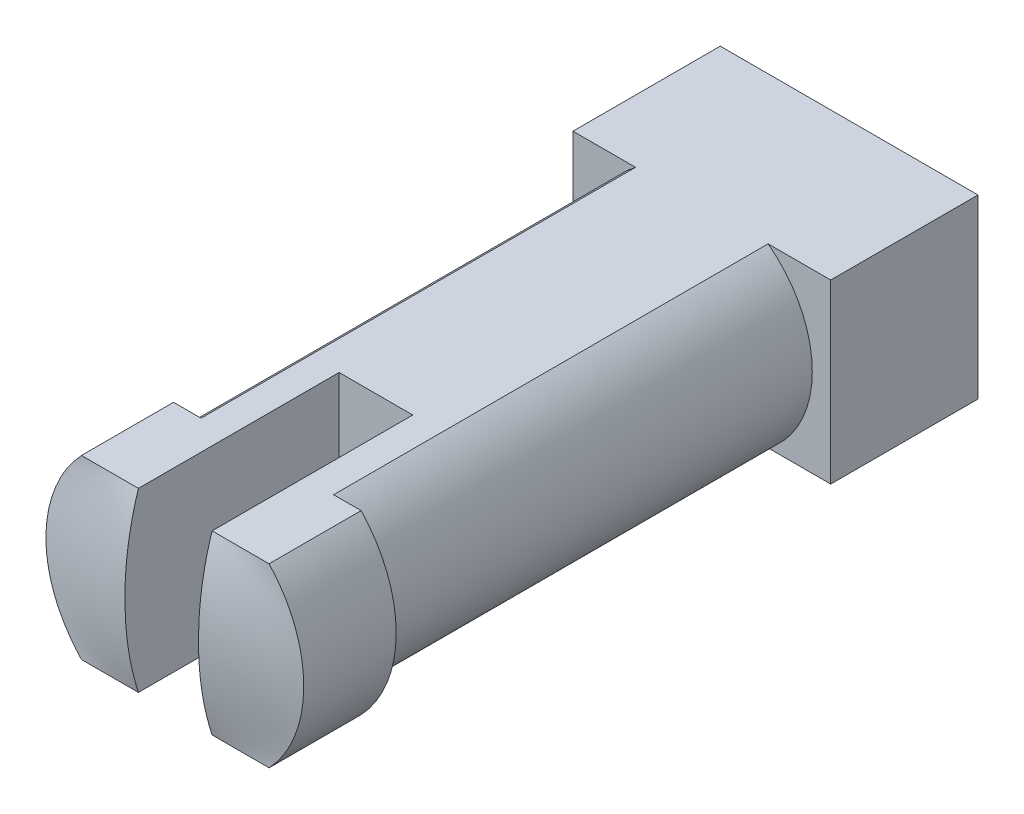
ISO-10303-21;
HEADER;
FILE_DESCRIPTION(('STEP AP214'),'2;1');
FILE_NAME('part.step','',(''),(''),'','','');
FILE_SCHEMA(('AUTOMOTIVE_DESIGN { 1 0 10303 214 1 1 1 1 }'));
ENDSEC;
DATA;
#1=APPLICATION_CONTEXT('core data for automotive mechanical design processes');
#2=APPLICATION_PROTOCOL_DEFINITION('international standard','automotive_design',2000,#1);
#3=PRODUCT_CONTEXT('',#1,'mechanical');
#4=PRODUCT('Part','Part','',(#3));
#5=PRODUCT_RELATED_PRODUCT_CATEGORY('part','',(#4));
#6=PRODUCT_DEFINITION_FORMATION('','',#4);
#7=PRODUCT_DEFINITION_CONTEXT('part definition',#1,'design');
#8=PRODUCT_DEFINITION('design','',#6,#7);
#9=PRODUCT_DEFINITION_SHAPE('','',#8);
#10=(LENGTH_UNIT() NAMED_UNIT(*) SI_UNIT(.MILLI.,.METRE.));
#11=(NAMED_UNIT(*) PLANE_ANGLE_UNIT() SI_UNIT($,.RADIAN.));
#12=(NAMED_UNIT(*) SI_UNIT($,.STERADIAN.) SOLID_ANGLE_UNIT());
#13=UNCERTAINTY_MEASURE_WITH_UNIT(LENGTH_MEASURE(1.E-05),#10,'distance_accuracy_value','');
#14=(GEOMETRIC_REPRESENTATION_CONTEXT(3) GLOBAL_UNCERTAINTY_ASSIGNED_CONTEXT((#13)) GLOBAL_UNIT_ASSIGNED_CONTEXT((#10,
#11,#12)) REPRESENTATION_CONTEXT('',''));
#15=CARTESIAN_POINT('',(0.,0.,0.));
#16=DIRECTION('',(0.,0.,1.));
#17=DIRECTION('',(1.,0.,0.));
#18=AXIS2_PLACEMENT_3D('',#15,#16,#17);
#19=CARTESIAN_POINT('',(-3.23538575752568,3.048,23.241));
#20=CARTESIAN_POINT('',(-4.93756576142003,1.2411729195063,23.241));
#21=CARTESIAN_POINT('',(-4.93756576142003,-1.2411729195063,23.241));
#22=CARTESIAN_POINT('',(-3.23538575752568,-3.048,23.241));
#23=CARTESIAN_POINT('',(-1.07846191917523,3.048,23.241));
#24=CARTESIAN_POINT('',(-1.64585525380668,1.2411729195063,24.1359422487845));
#25=CARTESIAN_POINT('',(-1.64585525380668,-1.2411729195063,24.1359422487845));
#26=CARTESIAN_POINT('',(-1.07846191917522,-3.048,23.241));
#27=CARTESIAN_POINT('',(1.07846191917522,3.048,23.241));
#28=CARTESIAN_POINT('',(1.64585525380668,1.2411729195063,24.1451220234833));
#29=CARTESIAN_POINT('',(1.64585525380668,-1.2411729195063,24.1594379233921));
#30=CARTESIAN_POINT('',(1.07846191917523,-3.048,23.241));
#31=CARTESIAN_POINT('',(3.23538575752567,3.048,23.241));
#32=CARTESIAN_POINT('',(4.93756576142003,1.2411729195063,23.241));
#33=CARTESIAN_POINT('',(4.93756576142003,-1.2411729195063,23.241));
#34=CARTESIAN_POINT('',(3.23538575752568,-3.048,23.241));
#35=B_SPLINE_SURFACE_WITH_KNOTS('',3,3,((#19,#20,#21,#22),(#23,#24,#25,#26),(#27,#28,#29,#30),
(#31,#32,#33,#34)),.UNSPECIFIED.,.F.,.F.,.F.,(4,4),(4,4),(0.,1.),(0.,1.),.UNSPECIFIED.);
#36=CARTESIAN_POINT('',(1.27,-3.048,23.241));
#37=CARTESIAN_POINT('',(1.27,-2.98361809001407,23.2616199668593));
#38=CARTESIAN_POINT('',(1.27,-2.91904839399948,23.28166091532));
#39=CARTESIAN_POINT('',(1.27,-2.78952708008224,23.3204759700285));
#40=CARTESIAN_POINT('',(1.27,-2.72457544801218,23.3392500289565));
#41=CARTESIAN_POINT('',(1.27,-2.59429304450364,23.3754197422777));
#42=CARTESIAN_POINT('',(1.27,-2.52896229852985,23.3928154881264));
#43=CARTESIAN_POINT('',(1.27,-2.39794292194821,23.4261934934623));
#44=CARTESIAN_POINT('',(1.27,-2.33225429646136,23.4421757731191));
#45=CARTESIAN_POINT('',(1.27,-2.13480759934364,23.4879507341408));
#46=CARTESIAN_POINT('',(1.27,-2.00254701375774,23.5156053736012));
#47=CARTESIAN_POINT('',(1.27,-1.73697427102652,23.5652610499949));
#48=CARTESIAN_POINT('',(1.27,-1.60366209596264,23.5872619903765));
#49=CARTESIAN_POINT('',(1.27,-1.33627003341765,23.6257470006934));
#50=CARTESIAN_POINT('',(1.27,-1.20219030398617,23.6422321675849));
#51=CARTESIAN_POINT('',(1.27,-0.933492433428444,23.6698224944221));
#52=CARTESIAN_POINT('',(1.27,-0.798874309185787,23.6809278217616));
#53=CARTESIAN_POINT('',(1.27,-0.394364696477986,23.7063568462903));
#54=CARTESIAN_POINT('',(1.27,-0.123936614210151,23.7127767714446));
#55=CARTESIAN_POINT('',(1.27,0.391924793308669,23.7052233223643));
#56=CARTESIAN_POINT('',(1.27,0.637386975211731,23.6930575217135));
#57=CARTESIAN_POINT('',(1.27,1.00445358419211,23.6617239221487));
#58=CARTESIAN_POINT('',(1.27,1.12663996829211,23.6490956361424));
#59=CARTESIAN_POINT('',(1.27,1.370476179666,23.6193925576498));
#60=CARTESIAN_POINT('',(1.27,1.4921260099845,23.6023177904277));
#61=CARTESIAN_POINT('',(1.27,1.73488029310617,23.5636052586751));
#62=CARTESIAN_POINT('',(1.27,1.85598368859805,23.5419608597912));
#63=CARTESIAN_POINT('',(1.27,2.09727421384968,23.494047606888));
#64=CARTESIAN_POINT('',(1.27,2.21746133503229,23.4677787096347));
#65=CARTESIAN_POINT('',(1.27,2.45675866229607,23.4106005695613));
#66=CARTESIAN_POINT('',(1.27,2.57586861028081,23.3796902443101));
#67=CARTESIAN_POINT('',(1.27,2.75360135853055,23.3300192607827));
#68=CARTESIAN_POINT('',(1.27,2.8126917744405,23.3129108610813));
#69=CARTESIAN_POINT('',(1.27,2.9305697461784,23.2776871685476));
#70=CARTESIAN_POINT('',(1.27,2.98935731260786,23.2595719112265));
#71=CARTESIAN_POINT('',(1.26999999999999,3.048,23.241));
#72=B_SPLINE_CURVE_WITH_KNOTS('',3,(#36,#37,#38,#39,#40,#41,#42,#43,#44,#45,#46,#47,#48,#49,#50,
#51,#52,#53,#54,#55,#56,#57,#58,#59,#60,#61,#62,#63,#64,#65,#66,#67,#68,#69,#70,#71),
.UNSPECIFIED.,.F.,.F.,(4,2,2,2,2,2,2,2,2,2,2,2,2,2,2,2,2,4),(0.,0.202810618084035,
0.405628807216389,0.608433527402601,0.811235353177018,1.21646039679443,1.62169236022623,
2.0268436846802,2.43198240202826,3.24261833494404,3.9792777958358,4.34772038886613,
4.71616088851028,5.08514002758012,5.45412261638596,5.82319138993944,6.00773540190165,
6.19227290923324),.UNSPECIFIED.);
#73=CARTESIAN_POINT('',(1.27,-3.048,23.241));
#74=VERTEX_POINT('',#73);
#75=CARTESIAN_POINT('',(1.27,3.048,23.241));
#76=VERTEX_POINT('',#75);
#77=EDGE_CURVE('E11',#74,#76,#72,.T.);
#78=DIRECTION('',(1.,0.,0.));
#79=VECTOR('',#78,1.);
#80=CARTESIAN_POINT('',(-2.286,-3.048,23.241));
#81=LINE('',#80,#79);
#82=CARTESIAN_POINT('',(3.23538575752568,-3.048,23.241));
#83=VERTEX_POINT('',#82);
#84=EDGE_CURVE('E284',#74,#83,#81,.T.);
#85=CARTESIAN_POINT('',(3.23538575752568,-3.048,23.241));
#86=CARTESIAN_POINT('',(3.27823965773945,-3.00251143007553,23.2409963092688));
#87=CARTESIAN_POINT('',(3.32012896308464,-2.95612454625603,23.2410004010047));
#88=CARTESIAN_POINT('',(3.40191428733265,-2.86162712767124,23.2410553199218));
#89=CARTESIAN_POINT('',(3.44181034127461,-2.81351662323082,23.2411061462812));
#90=CARTESIAN_POINT('',(3.55839399517923,-2.66673275440341,23.2413754329955));
#91=CARTESIAN_POINT('',(3.6319999774429,-2.56558273122173,23.2417106658315));
#92=CARTESIAN_POINT('',(3.77036833129577,-2.35753045271942,23.2427091299192));
#93=CARTESIAN_POINT('',(3.83513703097299,-2.25063239066294,23.2433721248816));
#94=CARTESIAN_POINT('',(3.95544678975065,-2.03176223528319,23.2449186783858));
#95=CARTESIAN_POINT('',(4.01098794806118,-1.91979019652937,23.245802234556));
#96=CARTESIAN_POINT('',(4.11246550816165,-1.69152589979072,23.2476482237771));
#97=CARTESIAN_POINT('',(4.15839823374478,-1.57523200822319,23.2486106868227));
#98=CARTESIAN_POINT('',(4.24032232775613,-1.33914492891008,23.2504750696737));
#99=CARTESIAN_POINT('',(4.27631002970501,-1.21935046854298,23.2513769670575));
#100=CARTESIAN_POINT('',(4.33804757909272,-0.977224818779088,23.2530026468781));
#101=CARTESIAN_POINT('',(4.36380335254754,-0.854895141027718,23.253726532321));
#102=CARTESIAN_POINT('',(4.40493082953281,-0.608457463728969,23.2549117393006));
#103=CARTESIAN_POINT('',(4.42029892688293,-0.484348861864968,23.2553729696454));
#104=CARTESIAN_POINT('',(4.44052632716147,-0.235287030360518,23.2559815352356));
#105=CARTESIAN_POINT('',(4.44538643555344,-0.110333866194456,23.25612889454));
#106=CARTESIAN_POINT('',(4.44456559640347,0.139537795811603,23.2560943124396));
#107=CARTESIAN_POINT('',(4.43888464702079,0.264456293645542,23.2559123709774));
#108=CARTESIAN_POINT('',(4.41701665106801,0.51343328881715,23.2552390280104));
#109=CARTESIAN_POINT('',(4.40082428163367,0.637491318237383,23.2547474697228));
#110=CARTESIAN_POINT('',(4.35805131044605,0.883757630595364,23.2535101046256));
#111=CARTESIAN_POINT('',(4.33147431755537,1.0059665408299,23.2527643861532));
#112=CARTESIAN_POINT('',(4.26810734425469,1.2477626453783,23.2511071783237));
#113=CARTESIAN_POINT('',(4.23131294803843,1.36734868196028,23.250195617351));
#114=CARTESIAN_POINT('',(4.14779320136627,1.60295098963437,23.2483258984882));
#115=CARTESIAN_POINT('',(4.10107152203599,1.71896856224411,23.2473677579242));
#116=CARTESIAN_POINT('',(3.99805667979804,1.94657674210435,23.2455454723184));
#117=CARTESIAN_POINT('',(3.94177018695416,2.05817036798248,23.2446812624577));
#118=CARTESIAN_POINT('',(3.82002439453851,2.27618597128392,23.243181963695));
#119=CARTESIAN_POINT('',(3.75456846637274,2.3826098302382,23.2425467908863));
#120=CARTESIAN_POINT('',(3.6175479892215,2.5856918230038,23.2416326546978));
#121=CARTESIAN_POINT('',(3.54630406601895,2.68256643258949,23.2413412405415));
#122=CARTESIAN_POINT('',(3.39634366066954,2.8700674014197,23.2410041030715));
#123=CARTESIAN_POINT('',(3.3176406032808,2.96070449755403,23.2409579465856));
#124=CARTESIAN_POINT('',(3.23538575752567,3.048,23.241));
#125=B_SPLINE_CURVE_WITH_KNOTS('',3,(#85,#86,#87,#88,#89,#90,#91,#92,#93,#94,#95,#96,#97,#98,
#99,#100,#101,#102,#103,#104,#105,#106,#107,#108,#109,#110,#111,#112,#113,#114,#115,#116,#117,
#118,#119,#120,#121,#122,#123,#124),.UNSPECIFIED.,.F.,.F.,(4,2,2,2,2,2,2,2,2,2,2,2,2,2,2,2,2,2,
2,4),(0.,0.187456956943611,0.374910617442541,0.749718103064125,1.12425577681104,
1.49878942344818,1.87346610641657,2.24828073949826,2.6228779739674,2.99760518672064,
3.37230367467984,3.74700222807099,4.12189067274094,4.49664895194681,4.87156944873247,
5.24635153985807,5.62087333964223,5.99525779541393,6.35561965513664,6.71534483465368),.UNSPECIFIED.);
#126=CARTESIAN_POINT('',(3.23538575752567,3.048,23.241));
#127=VERTEX_POINT('',#126);
#128=EDGE_CURVE('E212',#83,#127,#125,.T.);
#129=DIRECTION('',(-1.,0.,0.));
#130=VECTOR('',#129,1.);
#131=CARTESIAN_POINT('',(-2.286,3.048,23.241));
#132=LINE('',#131,#130);
#133=EDGE_CURVE('E161',#127,#76,#132,.T.);
#134=ORIENTED_EDGE('',*,*,#77,.F.);
#135=ORIENTED_EDGE('',*,*,#84,.T.);
#136=ORIENTED_EDGE('',*,*,#128,.T.);
#137=ORIENTED_EDGE('',*,*,#133,.T.);
#138=EDGE_LOOP('',(#134,#135,#136,#137));
#139=FACE_BOUND('',#138,.T.);
#140=ADVANCED_FACE('F38',(#139),#35,.F.);
#141=CARTESIAN_POINT('',(0.,0.,23.241));
#142=DIRECTION('',(0.,0.,-1.));
#143=DIRECTION('',(-1.,0.,0.));
#144=AXIS2_PLACEMENT_3D('',#141,#142,#143);
#145=CYLINDRICAL_SURFACE('',#144,3.81);
#146=CARTESIAN_POINT('',(0.,0.,20.066));
#147=DIRECTION('',(0.,0.,-1.));
#148=DIRECTION('',(1.,0.,0.));
#149=AXIS2_PLACEMENT_3D('',#146,#147,#148);
#150=CIRCLE('',#149,3.81);
#151=CARTESIAN_POINT('',(-2.286,-3.048,20.066));
#152=VERTEX_POINT('',#151);
#153=CARTESIAN_POINT('',(-2.286,3.048,20.066));
#154=VERTEX_POINT('',#153);
#155=EDGE_CURVE('E156',#152,#154,#150,.T.);
#156=ORIENTED_EDGE('',*,*,#155,.T.);
#157=DIRECTION('',(0.,0.,-1.));
#158=VECTOR('',#157,1.);
#159=CARTESIAN_POINT('',(-2.286,3.048,23.241));
#160=LINE('',#159,#158);
#161=CARTESIAN_POINT('',(-2.286,3.048,5.08));
#162=VERTEX_POINT('',#161);
#163=EDGE_CURVE('E151',#154,#162,#160,.T.);
#164=ORIENTED_EDGE('',*,*,#163,.T.);
#165=CARTESIAN_POINT('',(0.,0.,5.08));
#166=DIRECTION('',(0.,0.,1.));
#167=DIRECTION('',(1.,0.,0.));
#168=AXIS2_PLACEMENT_3D('',#165,#166,#167);
#169=CIRCLE('',#168,3.81);
#170=CARTESIAN_POINT('',(-2.286,-3.048,5.08));
#171=VERTEX_POINT('',#170);
#172=EDGE_CURVE('E155',#162,#171,#169,.T.);
#173=ORIENTED_EDGE('',*,*,#172,.T.);
#174=DIRECTION('',(0.,0.,-1.));
#175=VECTOR('',#174,1.);
#176=CARTESIAN_POINT('',(-2.286,-3.048,23.241));
#177=LINE('',#176,#175);
#178=EDGE_CURVE('E196',#152,#171,#177,.T.);
#179=ORIENTED_EDGE('',*,*,#178,.F.);
#180=EDGE_LOOP('',(#156,#164,#173,#179));
#181=FACE_BOUND('',#180,.T.);
#182=ADVANCED_FACE('F153',(#181),#145,.T.);
#183=CARTESIAN_POINT('',(0.,0.,5.08));
#184=DIRECTION('',(0.,0.,1.));
#185=DIRECTION('',(1.,0.,0.));
#186=AXIS2_PLACEMENT_3D('',#183,#184,#185);
#187=PLANE('',#186);
#188=ORIENTED_EDGE('',*,*,#172,.F.);
#189=DIRECTION('',(-1.,0.,0.));
#190=VECTOR('',#189,1.);
#191=CARTESIAN_POINT('',(-4.445,3.048,5.08));
#192=LINE('',#191,#190);
#193=CARTESIAN_POINT('',(-4.445,3.048,5.08));
#194=VERTEX_POINT('',#193);
#195=EDGE_CURVE('E166',#162,#194,#192,.T.);
#196=ORIENTED_EDGE('',*,*,#195,.T.);
#197=DIRECTION('',(0.,-1.,0.));
#198=VECTOR('',#197,1.);
#199=CARTESIAN_POINT('',(-4.445,3.048,5.08));
#200=LINE('',#199,#198);
#201=CARTESIAN_POINT('',(-4.445,-3.048,5.08));
#202=VERTEX_POINT('',#201);
#203=EDGE_CURVE('E182',#194,#202,#200,.T.);
#204=ORIENTED_EDGE('',*,*,#203,.T.);
#205=DIRECTION('',(1.,0.,0.));
#206=VECTOR('',#205,1.);
#207=CARTESIAN_POINT('',(-4.445,-3.048,5.08));
#208=LINE('',#207,#206);
#209=EDGE_CURVE('E169',#202,#171,#208,.T.);
#210=ORIENTED_EDGE('',*,*,#209,.T.);
#211=EDGE_LOOP('',(#188,#196,#204,#210));
#212=FACE_BOUND('',#211,.T.);
#213=ADVANCED_FACE('F165',(#212),#187,.T.);
#214=CARTESIAN_POINT('',(4.445,3.048,5.08));
#215=DIRECTION('',(-1.,0.,0.));
#216=DIRECTION('',(0.,0.,1.));
#217=AXIS2_PLACEMENT_3D('',#214,#215,#216);
#218=PLANE('',#217);
#219=DIRECTION('',(0.,1.,0.));
#220=VECTOR('',#219,1.);
#221=CARTESIAN_POINT('',(4.445,3.048,0.));
#222=LINE('',#221,#220);
#223=CARTESIAN_POINT('',(4.445,-3.048,0.));
#224=VERTEX_POINT('',#223);
#225=CARTESIAN_POINT('',(4.445,3.048,0.));
#226=VERTEX_POINT('',#225);
#227=EDGE_CURVE('E192',#224,#226,#222,.T.);
#228=ORIENTED_EDGE('',*,*,#227,.T.);
#229=DIRECTION('',(0.,0.,-1.));
#230=VECTOR('',#229,1.);
#231=CARTESIAN_POINT('',(4.445,3.048,5.08));
#232=LINE('',#231,#230);
#233=CARTESIAN_POINT('',(4.445,3.048,5.08));
#234=VERTEX_POINT('',#233);
#235=EDGE_CURVE('E207',#234,#226,#232,.T.);
#236=ORIENTED_EDGE('',*,*,#235,.F.);
#237=DIRECTION('',(0.,1.,0.));
#238=VECTOR('',#237,1.);
#239=CARTESIAN_POINT('',(4.445,3.048,5.08));
#240=LINE('',#239,#238);
#241=CARTESIAN_POINT('',(4.445,-3.048,5.08));
#242=VERTEX_POINT('',#241);
#243=EDGE_CURVE('E179',#242,#234,#240,.T.);
#244=ORIENTED_EDGE('',*,*,#243,.F.);
#245=DIRECTION('',(0.,0.,-1.));
#246=VECTOR('',#245,1.);
#247=CARTESIAN_POINT('',(4.445,-3.048,5.08));
#248=LINE('',#247,#246);
#249=EDGE_CURVE('E191',#242,#224,#248,.T.);
#250=ORIENTED_EDGE('',*,*,#249,.T.);
#251=EDGE_LOOP('',(#228,#236,#244,#250));
#252=FACE_BOUND('',#251,.T.);
#253=ADVANCED_FACE('F363',(#252),#218,.F.);
#254=CARTESIAN_POINT('',(-4.445,3.048,5.08));
#255=DIRECTION('',(0.,-1.,0.));
#256=DIRECTION('',(0.,0.,-1.));
#257=AXIS2_PLACEMENT_3D('',#254,#255,#256);
#258=PLANE('',#257);
#259=DIRECTION('',(-1.,0.,0.));
#260=VECTOR('',#259,1.);
#261=CARTESIAN_POINT('',(-1.27,3.048,16.3195));
#262=LINE('',#261,#260);
#263=CARTESIAN_POINT('',(1.27,3.048,16.3195));
#264=VERTEX_POINT('',#263);
#265=CARTESIAN_POINT('',(-1.27,3.048,16.3195));
#266=VERTEX_POINT('',#265);
#267=EDGE_CURVE('E331',#264,#266,#262,.T.);
#268=ORIENTED_EDGE('',*,*,#267,.F.);
#269=DIRECTION('',(0.,0.,-1.));
#270=VECTOR('',#269,1.);
#271=CARTESIAN_POINT('',(1.27,3.048,16.3195));
#272=LINE('',#271,#270);
#273=EDGE_CURVE('E334',#76,#264,#272,.T.);
#274=ORIENTED_EDGE('',*,*,#273,.F.);
#275=ORIENTED_EDGE('',*,*,#133,.F.);
#276=DIRECTION('',(0.,0.,1.));
#277=VECTOR('',#276,1.);
#278=CARTESIAN_POINT('',(3.23538575752567,3.048,20.066));
#279=LINE('',#278,#277);
#280=CARTESIAN_POINT('',(3.23538575752567,3.048,20.066));
#281=VERTEX_POINT('',#280);
#282=EDGE_CURVE('E246',#281,#127,#279,.T.);
#283=ORIENTED_EDGE('',*,*,#282,.F.);
#284=DIRECTION('',(-1.,0.,0.));
#285=VECTOR('',#284,1.);
#286=CARTESIAN_POINT('',(3.23538575752567,3.048,20.066));
#287=LINE('',#286,#285);
#288=CARTESIAN_POINT('',(2.286,3.048,20.066));
#289=VERTEX_POINT('',#288);
#290=EDGE_CURVE('E310',#281,#289,#287,.T.);
#291=ORIENTED_EDGE('',*,*,#290,.T.);
#292=DIRECTION('',(0.,0.,-1.));
#293=VECTOR('',#292,1.);
#294=CARTESIAN_POINT('',(2.286,3.048,23.241));
#295=LINE('',#294,#293);
#296=CARTESIAN_POINT('',(2.286,3.048,5.08));
#297=VERTEX_POINT('',#296);
#298=EDGE_CURVE('E160',#289,#297,#295,.T.);
#299=ORIENTED_EDGE('',*,*,#298,.T.);
#300=EDGE_CURVE('E178',#234,#297,#192,.T.);
#301=ORIENTED_EDGE('',*,*,#300,.F.);
#302=ORIENTED_EDGE('',*,*,#235,.T.);
#303=DIRECTION('',(-1.,0.,0.));
#304=VECTOR('',#303,1.);
#305=CARTESIAN_POINT('',(-4.445,3.048,0.));
#306=LINE('',#305,#304);
#307=CARTESIAN_POINT('',(-4.445,3.048,0.));
#308=VERTEX_POINT('',#307);
#309=EDGE_CURVE('E195',#226,#308,#306,.T.);
#310=ORIENTED_EDGE('',*,*,#309,.T.);
#311=DIRECTION('',(0.,0.,-1.));
#312=VECTOR('',#311,1.);
#313=CARTESIAN_POINT('',(-4.445,3.048,5.08));
#314=LINE('',#313,#312);
#315=EDGE_CURVE('E176',#194,#308,#314,.T.);
#316=ORIENTED_EDGE('',*,*,#315,.F.);
#317=ORIENTED_EDGE('',*,*,#195,.F.);
#318=ORIENTED_EDGE('',*,*,#163,.F.);
#319=DIRECTION('',(-1.,0.,0.));
#320=VECTOR('',#319,1.);
#321=CARTESIAN_POINT('',(-3.23538575752568,3.048,20.066));
#322=LINE('',#321,#320);
#323=CARTESIAN_POINT('',(-3.23538575752568,3.048,20.066));
#324=VERTEX_POINT('',#323);
#325=EDGE_CURVE('E302',#154,#324,#322,.T.);
#326=ORIENTED_EDGE('',*,*,#325,.T.);
#327=DIRECTION('',(0.,0.,1.));
#328=VECTOR('',#327,1.);
#329=CARTESIAN_POINT('',(-3.23538575752568,3.048,20.066));
#330=LINE('',#329,#328);
#331=CARTESIAN_POINT('',(-3.23538575752568,3.048,23.241));
#332=VERTEX_POINT('',#331);
#333=EDGE_CURVE('E282',#324,#332,#330,.T.);
#334=ORIENTED_EDGE('',*,*,#333,.T.);
#335=CARTESIAN_POINT('',(-1.27,3.048,23.241));
#336=VERTEX_POINT('',#335);
#337=EDGE_CURVE('E94',#336,#332,#132,.T.);
#338=ORIENTED_EDGE('',*,*,#337,.F.);
#339=DIRECTION('',(0.,0.,1.));
#340=VECTOR('',#339,1.);
#341=CARTESIAN_POINT('',(-1.27,3.048,16.3195));
#342=LINE('',#341,#340);
#343=EDGE_CURVE('E61',#266,#336,#342,.T.);
#344=ORIENTED_EDGE('',*,*,#343,.F.);
#345=EDGE_LOOP('',(#268,#274,#275,#283,#291,#299,#301,#302,#310,#316,#317,#318,#326,#334,#338,#344));
#346=FACE_BOUND('',#345,.T.);
#347=ADVANCED_FACE('F174',(#346),#258,.F.);
#348=CARTESIAN_POINT('',(-4.445,3.048,5.08));
#349=DIRECTION('',(1.,0.,0.));
#350=DIRECTION('',(0.,1.,0.));
#351=AXIS2_PLACEMENT_3D('',#348,#349,#350);
#352=PLANE('',#351);
#353=DIRECTION('',(0.,-1.,0.));
#354=VECTOR('',#353,1.);
#355=CARTESIAN_POINT('',(-4.445,3.048,0.));
#356=LINE('',#355,#354);
#357=CARTESIAN_POINT('',(-4.445,-3.048,0.));
#358=VERTEX_POINT('',#357);
#359=EDGE_CURVE('E198',#308,#358,#356,.T.);
#360=ORIENTED_EDGE('',*,*,#359,.T.);
#361=DIRECTION('',(0.,0.,-1.));
#362=VECTOR('',#361,1.);
#363=CARTESIAN_POINT('',(-4.445,-3.048,5.08));
#364=LINE('',#363,#362);
#365=EDGE_CURVE('E203',#202,#358,#364,.T.);
#366=ORIENTED_EDGE('',*,*,#365,.F.);
#367=ORIENTED_EDGE('',*,*,#203,.F.);
#368=ORIENTED_EDGE('',*,*,#315,.T.);
#369=EDGE_LOOP('',(#360,#366,#367,#368));
#370=FACE_BOUND('',#369,.T.);
#371=ADVANCED_FACE('F369',(#370),#352,.F.);
#372=CARTESIAN_POINT('',(-4.445,-3.048,5.08));
#373=DIRECTION('',(0.,1.,0.));
#374=DIRECTION('',(0.,0.,1.));
#375=AXIS2_PLACEMENT_3D('',#372,#373,#374);
#376=PLANE('',#375);
#377=ORIENTED_EDGE('',*,*,#84,.F.);
#378=DIRECTION('',(0.,0.,1.));
#379=VECTOR('',#378,1.);
#380=CARTESIAN_POINT('',(1.27,-3.048,16.3195));
#381=LINE('',#380,#379);
#382=CARTESIAN_POINT('',(1.27,-3.048,16.3195));
#383=VERTEX_POINT('',#382);
#384=EDGE_CURVE('E323',#383,#74,#381,.T.);
#385=ORIENTED_EDGE('',*,*,#384,.F.);
#386=DIRECTION('',(1.,0.,0.));
#387=VECTOR('',#386,1.);
#388=CARTESIAN_POINT('',(-1.27,-3.048,16.3195));
#389=LINE('',#388,#387);
#390=CARTESIAN_POINT('',(-1.27,-3.048,16.3195));
#391=VERTEX_POINT('',#390);
#392=EDGE_CURVE('E220',#391,#383,#389,.T.);
#393=ORIENTED_EDGE('',*,*,#392,.F.);
#394=DIRECTION('',(0.,0.,-1.));
#395=VECTOR('',#394,1.);
#396=CARTESIAN_POINT('',(-1.27,-3.048,16.3195));
#397=LINE('',#396,#395);
#398=CARTESIAN_POINT('',(-1.27,-3.048,23.241));
#399=VERTEX_POINT('',#398);
#400=EDGE_CURVE('E329',#399,#391,#397,.T.);
#401=ORIENTED_EDGE('',*,*,#400,.F.);
#402=CARTESIAN_POINT('',(-3.23538575752568,-3.048,23.241));
#403=VERTEX_POINT('',#402);
#404=EDGE_CURVE('E221',#403,#399,#81,.T.);
#405=ORIENTED_EDGE('',*,*,#404,.F.);
#406=DIRECTION('',(0.,0.,1.));
#407=VECTOR('',#406,1.);
#408=CARTESIAN_POINT('',(-3.23538575752568,-3.048,20.066));
#409=LINE('',#408,#407);
#410=CARTESIAN_POINT('',(-3.23538575752568,-3.048,20.066));
#411=VERTEX_POINT('',#410);
#412=EDGE_CURVE('E171',#411,#403,#409,.T.);
#413=ORIENTED_EDGE('',*,*,#412,.F.);
#414=DIRECTION('',(1.,0.,0.));
#415=VECTOR('',#414,1.);
#416=CARTESIAN_POINT('',(-2.286,-3.048,20.066));
#417=LINE('',#416,#415);
#418=EDGE_CURVE('E296',#411,#152,#417,.T.);
#419=ORIENTED_EDGE('',*,*,#418,.T.);
#420=ORIENTED_EDGE('',*,*,#178,.T.);
#421=ORIENTED_EDGE('',*,*,#209,.F.);
#422=ORIENTED_EDGE('',*,*,#365,.T.);
#423=DIRECTION('',(1.,0.,0.));
#424=VECTOR('',#423,1.);
#425=CARTESIAN_POINT('',(-4.445,-3.048,0.));
#426=LINE('',#425,#424);
#427=EDGE_CURVE('E184',#358,#224,#426,.T.);
#428=ORIENTED_EDGE('',*,*,#427,.T.);
#429=ORIENTED_EDGE('',*,*,#249,.F.);
#430=CARTESIAN_POINT('',(2.286,-3.048,5.08));
#431=VERTEX_POINT('',#430);
#432=EDGE_CURVE('E189',#431,#242,#208,.T.);
#433=ORIENTED_EDGE('',*,*,#432,.F.);
#434=DIRECTION('',(0.,0.,-1.));
#435=VECTOR('',#434,1.);
#436=CARTESIAN_POINT('',(2.286,-3.048,23.241));
#437=LINE('',#436,#435);
#438=CARTESIAN_POINT('',(2.286,-3.048,20.066));
#439=VERTEX_POINT('',#438);
#440=EDGE_CURVE('E70',#439,#431,#437,.T.);
#441=ORIENTED_EDGE('',*,*,#440,.F.);
#442=DIRECTION('',(1.,0.,0.));
#443=VECTOR('',#442,1.);
#444=CARTESIAN_POINT('',(2.286,-3.048,20.066));
#445=LINE('',#444,#443);
#446=CARTESIAN_POINT('',(3.23538575752568,-3.048,20.066));
#447=VERTEX_POINT('',#446);
#448=EDGE_CURVE('E317',#439,#447,#445,.T.);
#449=ORIENTED_EDGE('',*,*,#448,.T.);
#450=DIRECTION('',(0.,0.,1.));
#451=VECTOR('',#450,1.);
#452=CARTESIAN_POINT('',(3.23538575752568,-3.048,20.066));
#453=LINE('',#452,#451);
#454=EDGE_CURVE('E308',#447,#83,#453,.T.);
#455=ORIENTED_EDGE('',*,*,#454,.T.);
#456=EDGE_LOOP('',(#377,#385,#393,#401,#405,#413,#419,#420,#421,#422,#428,#429,#433,#441,#449,#455));
#457=FACE_BOUND('',#456,.T.);
#458=ADVANCED_FACE('F294',(#457),#376,.F.);
#459=CARTESIAN_POINT('',(0.,0.,5.08));
#460=DIRECTION('',(0.,0.,1.));
#461=DIRECTION('',(-1.,0.,0.));
#462=AXIS2_PLACEMENT_3D('',#459,#460,#461);
#463=CIRCLE('',#462,3.81);
#464=EDGE_CURVE('E170',#431,#297,#463,.T.);
#465=ORIENTED_EDGE('',*,*,#464,.F.);
#466=ORIENTED_EDGE('',*,*,#432,.T.);
#467=ORIENTED_EDGE('',*,*,#243,.T.);
#468=ORIENTED_EDGE('',*,*,#300,.T.);
#469=EDGE_LOOP('',(#465,#466,#467,#468));
#470=FACE_BOUND('',#469,.T.);
#471=ADVANCED_FACE('F359',(#470),#187,.T.);
#472=CARTESIAN_POINT('',(0.,0.,0.));
#473=DIRECTION('',(0.,0.,1.));
#474=DIRECTION('',(1.,0.,0.));
#475=AXIS2_PLACEMENT_3D('',#472,#473,#474);
#476=PLANE('',#475);
#477=ORIENTED_EDGE('',*,*,#227,.F.);
#478=ORIENTED_EDGE('',*,*,#427,.F.);
#479=ORIENTED_EDGE('',*,*,#359,.F.);
#480=ORIENTED_EDGE('',*,*,#309,.F.);
#481=EDGE_LOOP('',(#477,#478,#479,#480));
#482=FACE_BOUND('',#481,.T.);
#483=ADVANCED_FACE('F276',(#482),#476,.F.);
#484=CARTESIAN_POINT('',(0.,0.,23.241));
#485=DIRECTION('',(0.,0.,-1.));
#486=DIRECTION('',(-1.,0.,0.));
#487=AXIS2_PLACEMENT_3D('',#484,#485,#486);
#488=CYLINDRICAL_SURFACE('',#487,3.81);
#489=ORIENTED_EDGE('',*,*,#298,.F.);
#490=CARTESIAN_POINT('',(0.,0.,20.066));
#491=DIRECTION('',(0.,0.,-1.));
#492=DIRECTION('',(-1.,0.,0.));
#493=AXIS2_PLACEMENT_3D('',#490,#491,#492);
#494=CIRCLE('',#493,3.81);
#495=EDGE_CURVE('E102',#289,#439,#494,.T.);
#496=ORIENTED_EDGE('',*,*,#495,.T.);
#497=ORIENTED_EDGE('',*,*,#440,.T.);
#498=ORIENTED_EDGE('',*,*,#464,.T.);
#499=EDGE_LOOP('',(#489,#496,#497,#498));
#500=FACE_BOUND('',#499,.T.);
#501=ADVANCED_FACE('F239',(#500),#488,.T.);
#502=CARTESIAN_POINT('',(-1.27,3.048,23.241));
#503=CARTESIAN_POINT('',(-1.27,2.98203124521121,23.2618149460686));
#504=CARTESIAN_POINT('',(-1.27,2.91587578407752,23.2820461828954));
#505=CARTESIAN_POINT('',(-1.27,2.78318278282757,23.3212231661892));
#506=CARTESIAN_POINT('',(-1.27,2.71664522728037,23.3401688603377));
#507=CARTESIAN_POINT('',(-1.27,2.58318817409603,23.3766540339826));
#508=CARTESIAN_POINT('',(-1.27,2.5162686963125,23.3941935858745));
#509=CARTESIAN_POINT('',(-1.27,2.3820698616443,23.4278274119555));
#510=CARTESIAN_POINT('',(-1.27,2.31479051036423,23.4439217085836));
#511=CARTESIAN_POINT('',(-1.27,2.11253937889109,23.4899883024284));
#512=CARTESIAN_POINT('',(-1.27,1.97706151679804,23.5177697763192));
#513=CARTESIAN_POINT('',(-1.27,1.70505005645871,23.5675273701221));
#514=CARTESIAN_POINT('',(-1.27,1.56851644512511,23.5895034179496));
#515=CARTESIAN_POINT('',(-1.27,1.29467155249221,23.6277780509824));
#516=CARTESIAN_POINT('',(-1.27,1.15736036997718,23.6440773416292));
#517=CARTESIAN_POINT('',(-1.27,0.882207156643577,23.6711196496817));
#518=CARTESIAN_POINT('',(-1.27,0.74436514063288,23.6818628209634));
#519=CARTESIAN_POINT('',(-1.27,0.330235651944591,23.7059130892721));
#520=CARTESIAN_POINT('',(-1.27,0.0534225754939649,23.7110302112896));
#521=CARTESIAN_POINT('',(-1.27,-0.462284065793192,23.7003408563112));
#522=CARTESIAN_POINT('',(-1.27,-0.701243889466528,23.6872700216338));
#523=CARTESIAN_POINT('',(-1.27,-1.17768902815625,23.6444871492479));
#524=CARTESIAN_POINT('',(-1.27,-1.41517457156327,23.6147777576415));
#525=CARTESIAN_POINT('',(-1.27,-1.76947561339689,23.5571812269822));
#526=CARTESIAN_POINT('',(-1.27,-1.8873762047491,23.5357812852328));
#527=CARTESIAN_POINT('',(-1.27,-2.1222729562995,23.4885594021084));
#528=CARTESIAN_POINT('',(-1.27,-2.23926927464476,23.4627382531189));
#529=CARTESIAN_POINT('',(-1.27,-2.47223063510998,23.4066604832538));
#530=CARTESIAN_POINT('',(-1.27,-2.58819536662755,23.3764025714557));
#531=CARTESIAN_POINT('',(-1.27,-2.76126175486993,23.327860331554));
#532=CARTESIAN_POINT('',(-1.27,-2.81881062569609,23.3111514929692));
#533=CARTESIAN_POINT('',(-1.27,-2.93361908369456,23.2767735213926));
#534=CARTESIAN_POINT('',(-1.27,-2.99087868003879,23.2591044190591));
#535=CARTESIAN_POINT('',(-1.27,-3.048,23.241));
#536=B_SPLINE_CURVE_WITH_KNOTS('',3,(#502,#503,#504,#505,#506,#507,#508,#509,#510,#511,#512,
#513,#514,#515,#516,#517,#518,#519,#520,#521,#522,#523,#524,#525,#526,#527,#528,#529,#530,#531,
#532,#533,#534,#535),.UNSPECIFIED.,.F.,.F.,(4,2,2,2,2,2,2,2,2,2,2,2,2,2,2,2,4),(0.,
0.207524950812676,0.415058342335194,0.622581042079127,0.830100519260891,1.24485042980365,
1.65960548995613,2.07430899074619,2.48900100576724,3.31862010067453,4.03606162501128,
4.75338908388803,5.11280022161555,5.47214701160146,5.83159856553286,6.01136753371633,
6.1911307657983),.UNSPECIFIED.);
#537=EDGE_CURVE('E54',#336,#399,#536,.T.);
#538=CARTESIAN_POINT('',(-3.23538575752568,3.048,23.241));
#539=CARTESIAN_POINT('',(-3.27823992802996,3.00251114314864,23.2409964134002));
#540=CARTESIAN_POINT('',(-3.32012949097778,2.95612396170064,23.2410003899008));
#541=CARTESIAN_POINT('',(-3.40191589176866,2.86162524845704,23.2410539287195));
#542=CARTESIAN_POINT('',(-3.44181273609163,2.81351372226952,23.2411034908895));
#543=CARTESIAN_POINT('',(-3.55839809627275,2.66672736272538,23.2413661970618));
#544=CARTESIAN_POINT('',(-3.63200492541012,2.56557581248672,23.24169332549));
#545=CARTESIAN_POINT('',(-3.77037471797007,2.3575203287024,23.2426686230462));
#546=CARTESIAN_POINT('',(-3.83514401318335,2.25062059090617,23.2433165607684));
#547=CARTESIAN_POINT('',(-3.95545470599086,2.03174693148781,23.2448293460273));
#548=CARTESIAN_POINT('',(-4.01099620350414,1.9197730648253,23.2456941912152));
#549=CARTESIAN_POINT('',(-4.11247393699446,1.69150550090871,23.2475027287491));
#550=CARTESIAN_POINT('',(-4.15840653703518,1.57521018798211,23.2484464507532));
#551=CARTESIAN_POINT('',(-4.24033014937244,1.33912027959763,23.2502763789474));
#552=CARTESIAN_POINT('',(-4.27631749498847,1.21932441148364,23.2511625638324));
#553=CARTESIAN_POINT('',(-4.33805411120852,0.977195981198171,23.2527619473511));
#554=CARTESIAN_POINT('',(-4.36380930522765,0.854864929936209,23.2534752459754));
#555=CARTESIAN_POINT('',(-4.40493540752748,0.608424571277992,23.2546454611128));
#556=CARTESIAN_POINT('',(-4.42030270776828,0.484314661297526,23.2551022885361));
#557=CARTESIAN_POINT('',(-4.44052826370578,0.235250829166493,23.2557083871687));
#558=CARTESIAN_POINT('',(-4.44538736944149,0.110296976105321,23.2558576832551));
#559=CARTESIAN_POINT('',(-4.44456441555189,-0.139575987240435,23.2558327008392));
#560=CARTESIAN_POINT('',(-4.43888235419981,-0.264495097519324,23.2556584222839));
#561=CARTESIAN_POINT('',(-4.4170120283203,-0.513473211371209,23.2550049213912));
#562=CARTESIAN_POINT('',(-4.40081844434411,-0.637531747298743,23.2545255446586));
#563=CARTESIAN_POINT('',(-4.35804294079162,-0.883798998408144,23.2533154083815));
#564=CARTESIAN_POINT('',(-4.33146463012712,-1.00600834091476,23.2525847361781));
#565=CARTESIAN_POINT('',(-4.26809473635523,-1.24780591614628,23.2509585931212));
#566=CARTESIAN_POINT('',(-4.23129867755611,-1.36739297540478,23.2500630501074));
#567=CARTESIAN_POINT('',(-4.14777541111708,-1.60299713678463,23.248224370457));
#568=CARTESIAN_POINT('',(-4.10105187463809,-1.71901554048136,23.2472812515121));
#569=CARTESIAN_POINT('',(-3.99803315393394,-1.94662515494013,23.2454862011722));
#570=CARTESIAN_POINT('',(-3.94174463850184,-2.058219383874,23.2446342069142));
#571=CARTESIAN_POINT('',(-3.8199946785017,-2.27623591938041,23.2431552354587));
#572=CARTESIAN_POINT('',(-3.75453660551592,-2.3826601076567,23.2425281758547));
#573=CARTESIAN_POINT('',(-3.61751823262552,-2.58573298511237,23.2416254179007));
#574=CARTESIAN_POINT('',(-3.54627933115005,-2.68259868004569,23.241337411092));
#575=CARTESIAN_POINT('',(-3.39633031804852,-2.87008276321885,23.2410040858486));
#576=CARTESIAN_POINT('',(-3.31763363186121,-2.96071188906357,23.2409583394396));
#577=CARTESIAN_POINT('',(-3.23538575752568,-3.048,23.241));
#578=B_SPLINE_CURVE_WITH_KNOTS('',3,(#538,#539,#540,#541,#542,#543,#544,#545,#546,#547,#548,
#549,#550,#551,#552,#553,#554,#555,#556,#557,#558,#559,#560,#561,#562,#563,#564,#565,#566,#567,
#568,#569,#570,#571,#572,#573,#574,#575,#576,#577),.UNSPECIFIED.,.F.,.F.,(4,2,2,2,2,2,2,2,2,2,2,
2,2,2,2,2,2,2,2,4),(0.,0.187458137943976,0.374915666273268,0.749728288823995,1.12427094483189,
1.49880954500864,1.8734896125157,2.24830763575006,2.62290835872031,2.99763912545782,
3.37233957797854,3.74704009187992,4.12193037426867,4.49669049008064,4.87161502214077,
5.24640114843567,5.62092703447721,5.9953155696786,6.35564704675707,6.71534175363706),.UNSPECIFIED.);
#579=EDGE_CURVE('E241',#332,#403,#578,.T.);
#580=ORIENTED_EDGE('',*,*,#537,.F.);
#581=ORIENTED_EDGE('',*,*,#337,.T.);
#582=ORIENTED_EDGE('',*,*,#579,.T.);
#583=ORIENTED_EDGE('',*,*,#404,.T.);
#584=EDGE_LOOP('',(#580,#581,#582,#583));
#585=FACE_BOUND('',#584,.T.);
#586=ADVANCED_FACE('F40',(#585),#35,.F.);
#587=CARTESIAN_POINT('',(0.,0.,20.066));
#588=DIRECTION('',(0.,0.,1.));
#589=DIRECTION('',(1.,0.,0.));
#590=AXIS2_PLACEMENT_3D('',#587,#588,#589);
#591=CYLINDRICAL_SURFACE('',#590,4.445);
#592=ORIENTED_EDGE('',*,*,#579,.F.);
#593=ORIENTED_EDGE('',*,*,#333,.F.);
#594=CARTESIAN_POINT('',(0.,0.,20.066));
#595=DIRECTION('',(0.,0.,1.));
#596=DIRECTION('',(-1.,0.,0.));
#597=AXIS2_PLACEMENT_3D('',#594,#595,#596);
#598=CIRCLE('',#597,4.445);
#599=EDGE_CURVE('E300',#324,#411,#598,.T.);
#600=ORIENTED_EDGE('',*,*,#599,.T.);
#601=ORIENTED_EDGE('',*,*,#412,.T.);
#602=EDGE_LOOP('',(#592,#593,#600,#601));
#603=FACE_BOUND('',#602,.T.);
#604=ADVANCED_FACE('F233',(#603),#591,.T.);
#605=CARTESIAN_POINT('',(0.,0.,20.066));
#606=DIRECTION('',(0.,0.,1.));
#607=DIRECTION('',(1.,0.,0.));
#608=AXIS2_PLACEMENT_3D('',#605,#606,#607);
#609=PLANE('',#608);
#610=ORIENTED_EDGE('',*,*,#155,.F.);
#611=ORIENTED_EDGE('',*,*,#418,.F.);
#612=ORIENTED_EDGE('',*,*,#599,.F.);
#613=ORIENTED_EDGE('',*,*,#325,.F.);
#614=EDGE_LOOP('',(#610,#611,#612,#613));
#615=FACE_BOUND('',#614,.T.);
#616=ADVANCED_FACE('F229',(#615),#609,.F.);
#617=CARTESIAN_POINT('',(0.,0.,20.066));
#618=DIRECTION('',(0.,0.,1.));
#619=DIRECTION('',(1.,0.,0.));
#620=AXIS2_PLACEMENT_3D('',#617,#618,#619);
#621=CYLINDRICAL_SURFACE('',#620,4.445);
#622=ORIENTED_EDGE('',*,*,#128,.F.);
#623=ORIENTED_EDGE('',*,*,#454,.F.);
#624=CARTESIAN_POINT('',(0.,0.,20.066));
#625=DIRECTION('',(0.,0.,1.));
#626=DIRECTION('',(1.,0.,0.));
#627=AXIS2_PLACEMENT_3D('',#624,#625,#626);
#628=CIRCLE('',#627,4.445);
#629=EDGE_CURVE('E314',#447,#281,#628,.T.);
#630=ORIENTED_EDGE('',*,*,#629,.T.);
#631=ORIENTED_EDGE('',*,*,#282,.T.);
#632=EDGE_LOOP('',(#622,#623,#630,#631));
#633=FACE_BOUND('',#632,.T.);
#634=ADVANCED_FACE('F223',(#633),#621,.T.);
#635=CARTESIAN_POINT('',(0.,0.,20.066));
#636=DIRECTION('',(0.,0.,-1.));
#637=DIRECTION('',(-1.,0.,0.));
#638=AXIS2_PLACEMENT_3D('',#635,#636,#637);
#639=PLANE('',#638);
#640=ORIENTED_EDGE('',*,*,#495,.F.);
#641=ORIENTED_EDGE('',*,*,#290,.F.);
#642=ORIENTED_EDGE('',*,*,#629,.F.);
#643=ORIENTED_EDGE('',*,*,#448,.F.);
#644=EDGE_LOOP('',(#640,#641,#642,#643));
#645=FACE_BOUND('',#644,.T.);
#646=ADVANCED_FACE('F228',(#645),#639,.T.);
#647=CARTESIAN_POINT('',(1.27,-10.8996965646362,16.3195));
#648=DIRECTION('',(1.,0.,0.));
#649=DIRECTION('',(0.,0.,-1.));
#650=AXIS2_PLACEMENT_3D('',#647,#648,#649);
#651=PLANE('',#650);
#652=ORIENTED_EDGE('',*,*,#77,.T.);
#653=ORIENTED_EDGE('',*,*,#273,.T.);
#654=DIRECTION('',(0.,1.,0.));
#655=VECTOR('',#654,1.);
#656=CARTESIAN_POINT('',(1.27,-10.8996965646362,16.3195));
#657=LINE('',#656,#655);
#658=EDGE_CURVE('E324',#383,#264,#657,.T.);
#659=ORIENTED_EDGE('',*,*,#658,.F.);
#660=ORIENTED_EDGE('',*,*,#384,.T.);
#661=EDGE_LOOP('',(#652,#653,#659,#660));
#662=FACE_BOUND('',#661,.T.);
#663=ADVANCED_FACE('F257',(#662),#651,.F.);
#664=CARTESIAN_POINT('',(-1.27,-10.8996965646362,16.3195));
#665=DIRECTION('',(-1.,0.,0.));
#666=DIRECTION('',(0.,0.,1.));
#667=AXIS2_PLACEMENT_3D('',#664,#665,#666);
#668=PLANE('',#667);
#669=ORIENTED_EDGE('',*,*,#537,.T.);
#670=ORIENTED_EDGE('',*,*,#400,.T.);
#671=DIRECTION('',(0.,1.,0.));
#672=VECTOR('',#671,1.);
#673=CARTESIAN_POINT('',(-1.27,-10.8996965646362,16.3195));
#674=LINE('',#673,#672);
#675=EDGE_CURVE('E327',#391,#266,#674,.T.);
#676=ORIENTED_EDGE('',*,*,#675,.T.);
#677=ORIENTED_EDGE('',*,*,#343,.T.);
#678=EDGE_LOOP('',(#669,#670,#676,#677));
#679=FACE_BOUND('',#678,.T.);
#680=ADVANCED_FACE('F252',(#679),#668,.F.);
#681=CARTESIAN_POINT('',(-1.27,-10.8996965646362,16.3195));
#682=DIRECTION('',(0.,0.,-1.));
#683=DIRECTION('',(-1.,0.,0.));
#684=AXIS2_PLACEMENT_3D('',#681,#682,#683);
#685=PLANE('',#684);
#686=ORIENTED_EDGE('',*,*,#392,.T.);
#687=ORIENTED_EDGE('',*,*,#658,.T.);
#688=ORIENTED_EDGE('',*,*,#267,.T.);
#689=ORIENTED_EDGE('',*,*,#675,.F.);
#690=EDGE_LOOP('',(#686,#687,#688,#689));
#691=FACE_BOUND('',#690,.T.);
#692=ADVANCED_FACE('F256',(#691),#685,.F.);
#693=CLOSED_SHELL('',(#140,#182,#213,#253,#347,#371,#458,#471,#483,#501,#586,#604,#616,#634,
#646,#663,#680,#692));
#694=MANIFOLD_SOLID_BREP('B2',#693);
#695=ADVANCED_BREP_SHAPE_REPRESENTATION('',(#18,#694),#14);
#696=SHAPE_DEFINITION_REPRESENTATION(#9,#695);
ENDSEC;
END-ISO-10303-21;
